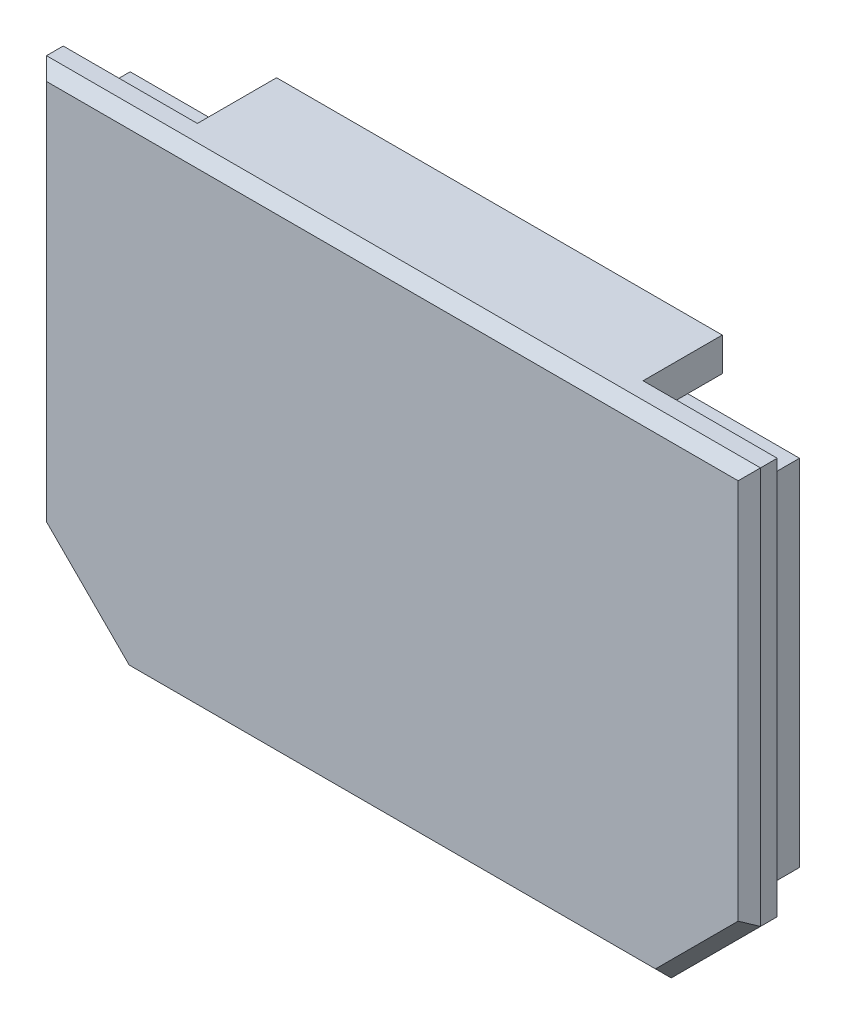
ISO-10303-21;
HEADER;
FILE_DESCRIPTION(('STEP AP214'),'2;1');
FILE_NAME('part.step','',(''),(''),'','','');
FILE_SCHEMA(('AUTOMOTIVE_DESIGN { 1 0 10303 214 1 1 1 1 }'));
ENDSEC;
DATA;
#1=APPLICATION_CONTEXT('core data for automotive mechanical design processes');
#2=APPLICATION_PROTOCOL_DEFINITION('international standard','automotive_design',2000,#1);
#3=PRODUCT_CONTEXT('',#1,'mechanical');
#4=PRODUCT('Part','Part','',(#3));
#5=PRODUCT_RELATED_PRODUCT_CATEGORY('part','',(#4));
#6=PRODUCT_DEFINITION_FORMATION('','',#4);
#7=PRODUCT_DEFINITION_CONTEXT('part definition',#1,'design');
#8=PRODUCT_DEFINITION('design','',#6,#7);
#9=PRODUCT_DEFINITION_SHAPE('','',#8);
#10=(LENGTH_UNIT() NAMED_UNIT(*) SI_UNIT(.MILLI.,.METRE.));
#11=(NAMED_UNIT(*) PLANE_ANGLE_UNIT() SI_UNIT($,.RADIAN.));
#12=(NAMED_UNIT(*) SI_UNIT($,.STERADIAN.) SOLID_ANGLE_UNIT());
#13=UNCERTAINTY_MEASURE_WITH_UNIT(LENGTH_MEASURE(1.E-05),#10,'distance_accuracy_value','');
#14=(GEOMETRIC_REPRESENTATION_CONTEXT(3) GLOBAL_UNCERTAINTY_ASSIGNED_CONTEXT((#13)) GLOBAL_UNIT_ASSIGNED_CONTEXT((#10,
#11,#12)) REPRESENTATION_CONTEXT('',''));
#15=CARTESIAN_POINT('',(0.,0.,0.));
#16=DIRECTION('',(0.,0.,1.));
#17=DIRECTION('',(1.,0.,0.));
#18=AXIS2_PLACEMENT_3D('',#15,#16,#17);
#19=CARTESIAN_POINT('',(-29.9999,-3.0001,-4.));
#20=DIRECTION('',(0.,1.,0.));
#21=DIRECTION('',(0.,0.,1.));
#22=AXIS2_PLACEMENT_3D('',#19,#20,#21);
#23=PLANE('',#22);
#24=DIRECTION('',(-1.,0.,0.));
#25=VECTOR('',#24,1.);
#26=CARTESIAN_POINT('',(-29.9999,-3.0001,-4.));
#27=LINE('',#26,#25);
#28=CARTESIAN_POINT('',(29.9999000000061,-3.0001,-4.));
#29=VERTEX_POINT('',#28);
#30=CARTESIAN_POINT('',(19.9750000000061,-3.0001,-4.));
#31=VERTEX_POINT('',#30);
#32=EDGE_CURVE('E430',#29,#31,#27,.T.);
#33=ORIENTED_EDGE('',*,*,#32,.T.);
#34=DIRECTION('',(0.,0.,1.));
#35=VECTOR('',#34,1.);
#36=CARTESIAN_POINT('',(19.9750000000061,-3.0001,-7.1));
#37=LINE('',#36,#35);
#38=CARTESIAN_POINT('',(19.9750000000061,-3.0001,0.));
#39=VERTEX_POINT('',#38);
#40=EDGE_CURVE('E272',#31,#39,#37,.T.);
#41=ORIENTED_EDGE('',*,*,#40,.T.);
#42=DIRECTION('',(-1.,0.,0.));
#43=VECTOR('',#42,1.);
#44=CARTESIAN_POINT('',(-29.9999,-3.0001,0.));
#45=LINE('',#44,#43);
#46=CARTESIAN_POINT('',(29.9999000000061,-3.0001,0.));
#47=VERTEX_POINT('',#46);
#48=EDGE_CURVE('E413',#47,#39,#45,.T.);
#49=ORIENTED_EDGE('',*,*,#48,.F.);
#50=DIRECTION('',(0.,0.,1.));
#51=VECTOR('',#50,1.);
#52=CARTESIAN_POINT('',(29.9999000000061,-3.0001,-4.));
#53=LINE('',#52,#51);
#54=EDGE_CURVE('E461',#29,#47,#53,.T.);
#55=ORIENTED_EDGE('',*,*,#54,.F.);
#56=EDGE_LOOP('',(#33,#41,#49,#55));
#57=FACE_BOUND('',#56,.T.);
#58=ADVANCED_FACE('F41',(#57),#23,.T.);
#59=CARTESIAN_POINT('',(-19.975,-3.0001,0.));
#60=VERTEX_POINT('',#59);
#61=CARTESIAN_POINT('',(-29.9999,-3.0001,0.));
#62=VERTEX_POINT('',#61);
#63=EDGE_CURVE('E452',#60,#62,#45,.T.);
#64=ORIENTED_EDGE('',*,*,#63,.F.);
#65=DIRECTION('',(0.,0.,1.));
#66=VECTOR('',#65,1.);
#67=CARTESIAN_POINT('',(-19.975,-3.0001,-7.1));
#68=LINE('',#67,#66);
#69=CARTESIAN_POINT('',(-19.975,-3.0001,-4.));
#70=VERTEX_POINT('',#69);
#71=EDGE_CURVE('E834',#70,#60,#68,.T.);
#72=ORIENTED_EDGE('',*,*,#71,.F.);
#73=CARTESIAN_POINT('',(-29.9999,-3.0001,-4.));
#74=VERTEX_POINT('',#73);
#75=EDGE_CURVE('E429',#70,#74,#27,.T.);
#76=ORIENTED_EDGE('',*,*,#75,.T.);
#77=DIRECTION('',(0.,0.,1.));
#78=VECTOR('',#77,1.);
#79=CARTESIAN_POINT('',(-29.9999,-3.0001,-4.));
#80=LINE('',#79,#78);
#81=EDGE_CURVE('E456',#74,#62,#80,.T.);
#82=ORIENTED_EDGE('',*,*,#81,.T.);
#83=EDGE_LOOP('',(#64,#72,#76,#82));
#84=FACE_BOUND('',#83,.T.);
#85=ADVANCED_FACE('F637',(#84),#23,.T.);
#86=CARTESIAN_POINT('',(0.,0.,0.));
#87=DIRECTION('',(0.,0.,-1.));
#88=DIRECTION('',(-1.,0.,0.));
#89=AXIS2_PLACEMENT_3D('',#86,#87,#88);
#90=PLANE('',#89);
#91=ORIENTED_EDGE('',*,*,#48,.T.);
#92=DIRECTION('',(0.,-1.,0.));
#93=VECTOR('',#92,1.);
#94=CARTESIAN_POINT('',(19.9750000000061,4.55020154334958E-12,0.));
#95=LINE('',#94,#93);
#96=CARTESIAN_POINT('',(19.9750000000061,4.55020154334958E-12,0.));
#97=VERTEX_POINT('',#96);
#98=EDGE_CURVE('E837',#97,#39,#95,.T.);
#99=ORIENTED_EDGE('',*,*,#98,.F.);
#100=DIRECTION('',(-1.,0.,0.));
#101=VECTOR('',#100,1.);
#102=CARTESIAN_POINT('',(-32.,0.,0.));
#103=LINE('',#102,#101);
#104=CARTESIAN_POINT('',(32.0000000000054,4.55020154334958E-12,0.));
#105=VERTEX_POINT('',#104);
#106=EDGE_CURVE('E311',#105,#97,#103,.T.);
#107=ORIENTED_EDGE('',*,*,#106,.F.);
#108=DIRECTION('',(0.,1.,0.));
#109=VECTOR('',#108,1.);
#110=CARTESIAN_POINT('',(32.0000000000054,4.55020154334958E-12,0.));
#111=LINE('',#110,#109);
#112=CARTESIAN_POINT('',(32.0000000000054,-35.6000000000053,0.));
#113=VERTEX_POINT('',#112);
#114=EDGE_CURVE('E306',#113,#105,#111,.T.);
#115=ORIENTED_EDGE('',*,*,#114,.F.);
#116=DIRECTION('',(0.707106781186548,0.707106781186547,0.));
#117=VECTOR('',#116,1.);
#118=CARTESIAN_POINT('',(32.0000000000054,-35.6000000000053,0.));
#119=LINE('',#118,#117);
#120=CARTESIAN_POINT('',(24.0000000000107,-43.6,0.));
#121=VERTEX_POINT('',#120);
#122=EDGE_CURVE('E302',#121,#113,#119,.T.);
#123=ORIENTED_EDGE('',*,*,#122,.F.);
#124=DIRECTION('',(1.,0.,0.));
#125=VECTOR('',#124,1.);
#126=CARTESIAN_POINT('',(24.0000000000107,-43.6,0.));
#127=LINE('',#126,#125);
#128=CARTESIAN_POINT('',(2.74999999999999,-43.6,0.));
#129=VERTEX_POINT('',#128);
#130=EDGE_CURVE('E299',#129,#121,#127,.T.);
#131=ORIENTED_EDGE('',*,*,#130,.F.);
#132=DIRECTION('',(0.,-1.,0.));
#133=VECTOR('',#132,1.);
#134=CARTESIAN_POINT('',(2.74999999999999,-35.4152415615735,0.));
#135=LINE('',#134,#133);
#136=CARTESIAN_POINT('',(2.74999999999999,-41.5999,0.));
#137=VERTEX_POINT('',#136);
#138=EDGE_CURVE('E551',#129,#137,#135,.F.);
#139=ORIENTED_EDGE('',*,*,#138,.T.);
#140=DIRECTION('',(1.,0.,0.));
#141=VECTOR('',#140,1.);
#142=CARTESIAN_POINT('',(23.171531453909,-41.5999,0.));
#143=LINE('',#142,#141);
#144=CARTESIAN_POINT('',(23.171531453909,-41.5999,0.));
#145=VERTEX_POINT('',#144);
#146=EDGE_CURVE('E441',#137,#145,#143,.T.);
#147=ORIENTED_EDGE('',*,*,#146,.T.);
#148=DIRECTION('',(0.707106781186547,0.707106781186548,0.));
#149=VECTOR('',#148,1.);
#150=CARTESIAN_POINT('',(29.9999000000061,-34.7715314539029,0.));
#151=LINE('',#150,#149);
#152=CARTESIAN_POINT('',(29.9999000000061,-34.7715314539029,0.));
#153=VERTEX_POINT('',#152);
#154=EDGE_CURVE('E444',#145,#153,#151,.T.);
#155=ORIENTED_EDGE('',*,*,#154,.T.);
#156=DIRECTION('',(0.,1.,0.));
#157=VECTOR('',#156,1.);
#158=CARTESIAN_POINT('',(29.9999000000061,-3.0001,0.));
#159=LINE('',#158,#157);
#160=EDGE_CURVE('E448',#153,#47,#159,.T.);
#161=ORIENTED_EDGE('',*,*,#160,.T.);
#162=EDGE_LOOP('',(#91,#99,#107,#115,#123,#131,#139,#147,#155,#161));
#163=FACE_BOUND('',#162,.T.);
#164=ADVANCED_FACE('F582',(#163),#90,.T.);
#165=CARTESIAN_POINT('',(-19.975,8.54940211855845E-13,0.));
#166=VERTEX_POINT('',#165);
#167=CARTESIAN_POINT('',(-32.,0.,0.));
#168=VERTEX_POINT('',#167);
#169=EDGE_CURVE('E310',#166,#168,#103,.T.);
#170=ORIENTED_EDGE('',*,*,#169,.F.);
#171=DIRECTION('',(0.,1.,0.));
#172=VECTOR('',#171,1.);
#173=CARTESIAN_POINT('',(-19.975,4.55020154334958E-12,0.));
#174=LINE('',#173,#172);
#175=EDGE_CURVE('E268',#60,#166,#174,.T.);
#176=ORIENTED_EDGE('',*,*,#175,.F.);
#177=ORIENTED_EDGE('',*,*,#63,.T.);
#178=DIRECTION('',(0.,-1.,0.));
#179=VECTOR('',#178,1.);
#180=CARTESIAN_POINT('',(-29.9999,-34.7715314538976,0.));
#181=LINE('',#180,#179);
#182=CARTESIAN_POINT('',(-29.9999,-34.7715314538976,0.));
#183=VERTEX_POINT('',#182);
#184=EDGE_CURVE('E388',#62,#183,#181,.T.);
#185=ORIENTED_EDGE('',*,*,#184,.T.);
#186=DIRECTION('',(0.707106781186548,-0.707106781186547,0.));
#187=VECTOR('',#186,1.);
#188=CARTESIAN_POINT('',(-23.1715314538976,-41.5999,0.));
#189=LINE('',#188,#187);
#190=CARTESIAN_POINT('',(-23.1715314538976,-41.5999,0.));
#191=VERTEX_POINT('',#190);
#192=EDGE_CURVE('E438',#183,#191,#189,.T.);
#193=ORIENTED_EDGE('',*,*,#192,.T.);
#194=CARTESIAN_POINT('',(-2.74999999999998,-41.5999,0.));
#195=VERTEX_POINT('',#194);
#196=EDGE_CURVE('E79',#191,#195,#143,.T.);
#197=ORIENTED_EDGE('',*,*,#196,.T.);
#198=DIRECTION('',(0.,1.,0.));
#199=VECTOR('',#198,1.);
#200=CARTESIAN_POINT('',(-2.74999999999998,-35.4152415615735,0.));
#201=LINE('',#200,#199);
#202=CARTESIAN_POINT('',(-2.74999999999998,-43.6,0.));
#203=VERTEX_POINT('',#202);
#204=EDGE_CURVE('E51',#195,#203,#201,.F.);
#205=ORIENTED_EDGE('',*,*,#204,.T.);
#206=CARTESIAN_POINT('',(-24.,-43.6,0.));
#207=VERTEX_POINT('',#206);
#208=EDGE_CURVE('E66',#207,#203,#127,.T.);
#209=ORIENTED_EDGE('',*,*,#208,.F.);
#210=DIRECTION('',(0.707106781186549,-0.707106781186547,0.));
#211=VECTOR('',#210,1.);
#212=CARTESIAN_POINT('',(-24.,-43.6,0.));
#213=LINE('',#212,#211);
#214=CARTESIAN_POINT('',(-32.,-35.6,0.));
#215=VERTEX_POINT('',#214);
#216=EDGE_CURVE('E294',#215,#207,#213,.T.);
#217=ORIENTED_EDGE('',*,*,#216,.F.);
#218=DIRECTION('',(0.,-1.,0.));
#219=VECTOR('',#218,1.);
#220=CARTESIAN_POINT('',(-32.,-35.6,0.));
#221=LINE('',#220,#219);
#222=EDGE_CURVE('E290',#168,#215,#221,.T.);
#223=ORIENTED_EDGE('',*,*,#222,.F.);
#224=EDGE_LOOP('',(#170,#176,#177,#185,#193,#197,#205,#209,#217,#223));
#225=FACE_BOUND('',#224,.T.);
#226=ADVANCED_FACE('F557',(#225),#90,.T.);
#227=CARTESIAN_POINT('',(-29.9999,-34.7715314538976,-4.));
#228=DIRECTION('',(-1.,0.,0.));
#229=DIRECTION('',(0.,0.,1.));
#230=AXIS2_PLACEMENT_3D('',#227,#228,#229);
#231=PLANE('',#230);
#232=ORIENTED_EDGE('',*,*,#184,.F.);
#233=ORIENTED_EDGE('',*,*,#81,.F.);
#234=DIRECTION('',(0.,-1.,0.));
#235=VECTOR('',#234,1.);
#236=CARTESIAN_POINT('',(-29.9999,-34.7715314538976,-4.));
#237=LINE('',#236,#235);
#238=CARTESIAN_POINT('',(-29.9999,-34.7715314538976,-4.));
#239=VERTEX_POINT('',#238);
#240=EDGE_CURVE('E408',#74,#239,#237,.T.);
#241=ORIENTED_EDGE('',*,*,#240,.T.);
#242=DIRECTION('',(0.,0.,1.));
#243=VECTOR('',#242,1.);
#244=CARTESIAN_POINT('',(-29.9999,-34.7715314538976,-4.));
#245=LINE('',#244,#243);
#246=EDGE_CURVE('E434',#239,#183,#245,.T.);
#247=ORIENTED_EDGE('',*,*,#246,.T.);
#248=EDGE_LOOP('',(#232,#233,#241,#247));
#249=FACE_BOUND('',#248,.T.);
#250=ADVANCED_FACE('F652',(#249),#231,.T.);
#251=CARTESIAN_POINT('',(29.9999000000061,-3.0001,-4.));
#252=DIRECTION('',(1.,0.,0.));
#253=DIRECTION('',(0.,1.,0.));
#254=AXIS2_PLACEMENT_3D('',#251,#252,#253);
#255=PLANE('',#254);
#256=ORIENTED_EDGE('',*,*,#160,.F.);
#257=DIRECTION('',(0.,0.,1.));
#258=VECTOR('',#257,1.);
#259=CARTESIAN_POINT('',(29.9999000000061,-34.7715314539029,-4.));
#260=LINE('',#259,#258);
#261=CARTESIAN_POINT('',(29.9999000000061,-34.7715314539029,-4.));
#262=VERTEX_POINT('',#261);
#263=EDGE_CURVE('E464',#262,#153,#260,.T.);
#264=ORIENTED_EDGE('',*,*,#263,.F.);
#265=DIRECTION('',(0.,1.,0.));
#266=VECTOR('',#265,1.);
#267=CARTESIAN_POINT('',(29.9999000000061,-3.0001,-4.));
#268=LINE('',#267,#266);
#269=EDGE_CURVE('E425',#262,#29,#268,.T.);
#270=ORIENTED_EDGE('',*,*,#269,.T.);
#271=ORIENTED_EDGE('',*,*,#54,.T.);
#272=EDGE_LOOP('',(#256,#264,#270,#271));
#273=FACE_BOUND('',#272,.T.);
#274=ADVANCED_FACE('F648',(#273),#255,.T.);
#275=CARTESIAN_POINT('',(29.9999000000061,-34.7715314539029,-4.));
#276=DIRECTION('',(0.707106781186548,-0.707106781186547,0.));
#277=DIRECTION('',(0.707106781186547,0.707106781186548,0.));
#278=AXIS2_PLACEMENT_3D('',#275,#276,#277);
#279=PLANE('',#278);
#280=ORIENTED_EDGE('',*,*,#154,.F.);
#281=DIRECTION('',(0.,0.,1.));
#282=VECTOR('',#281,1.);
#283=CARTESIAN_POINT('',(23.171531453909,-41.5999,-4.));
#284=LINE('',#283,#282);
#285=CARTESIAN_POINT('',(23.171531453909,-41.5999,-4.));
#286=VERTEX_POINT('',#285);
#287=EDGE_CURVE('E467',#286,#145,#284,.T.);
#288=ORIENTED_EDGE('',*,*,#287,.F.);
#289=DIRECTION('',(0.707106781186547,0.707106781186548,0.));
#290=VECTOR('',#289,1.);
#291=CARTESIAN_POINT('',(29.9999000000061,-34.7715314539029,-4.));
#292=LINE('',#291,#290);
#293=EDGE_CURVE('E421',#286,#262,#292,.T.);
#294=ORIENTED_EDGE('',*,*,#293,.T.);
#295=ORIENTED_EDGE('',*,*,#263,.T.);
#296=EDGE_LOOP('',(#280,#288,#294,#295));
#297=FACE_BOUND('',#296,.T.);
#298=ADVANCED_FACE('F651',(#297),#279,.T.);
#299=CARTESIAN_POINT('',(23.171531453909,-41.5999,-4.));
#300=DIRECTION('',(0.,-1.,0.));
#301=DIRECTION('',(1.,0.,0.));
#302=AXIS2_PLACEMENT_3D('',#299,#300,#301);
#303=PLANE('',#302);
#304=ORIENTED_EDGE('',*,*,#146,.F.);
#305=DIRECTION('',(0.707106781186551,0.,-0.707106781186544));
#306=VECTOR('',#305,1.);
#307=CARTESIAN_POINT('',(14.9607657269546,-41.5999,-12.2107657269545));
#308=LINE('',#307,#306);
#309=CARTESIAN_POINT('',(1.99999999999998,-41.5999,0.75));
#310=VERTEX_POINT('',#309);
#311=EDGE_CURVE('E544',#137,#310,#308,.F.);
#312=ORIENTED_EDGE('',*,*,#311,.T.);
#313=DIRECTION('',(1.,0.,0.));
#314=VECTOR('',#313,1.);
#315=CARTESIAN_POINT('',(-3.,-41.5999,0.75));
#316=LINE('',#315,#314);
#317=CARTESIAN_POINT('',(-1.99999999999999,-41.5999,0.75));
#318=VERTEX_POINT('',#317);
#319=EDGE_CURVE('E285',#318,#310,#316,.T.);
#320=ORIENTED_EDGE('',*,*,#319,.F.);
#321=DIRECTION('',(0.707106781186544,0.,0.707106781186551));
#322=VECTOR('',#321,1.);
#323=CARTESIAN_POINT('',(8.21076572695439,-41.5999,10.9607657269545));
#324=LINE('',#323,#322);
#325=EDGE_CURVE('E541',#318,#195,#324,.F.);
#326=ORIENTED_EDGE('',*,*,#325,.T.);
#327=ORIENTED_EDGE('',*,*,#196,.F.);
#328=DIRECTION('',(0.,0.,1.));
#329=VECTOR('',#328,1.);
#330=CARTESIAN_POINT('',(-23.1715314538976,-41.5999,-4.));
#331=LINE('',#330,#329);
#332=CARTESIAN_POINT('',(-23.1715314538976,-41.5999,-4.));
#333=VERTEX_POINT('',#332);
#334=EDGE_CURVE('E471',#333,#191,#331,.T.);
#335=ORIENTED_EDGE('',*,*,#334,.F.);
#336=DIRECTION('',(1.,0.,0.));
#337=VECTOR('',#336,1.);
#338=CARTESIAN_POINT('',(23.171531453909,-41.5999,-4.));
#339=LINE('',#338,#337);
#340=EDGE_CURVE('E417',#333,#286,#339,.T.);
#341=ORIENTED_EDGE('',*,*,#340,.T.);
#342=ORIENTED_EDGE('',*,*,#287,.T.);
#343=EDGE_LOOP('',(#304,#312,#320,#326,#327,#335,#341,#342));
#344=FACE_BOUND('',#343,.T.);
#345=ADVANCED_FACE('F566',(#344),#303,.T.);
#346=CARTESIAN_POINT('',(-23.1715314538976,-41.5999,-4.));
#347=DIRECTION('',(-0.707106781186547,-0.707106781186548,0.));
#348=DIRECTION('',(0.707106781186548,-0.707106781186547,0.));
#349=AXIS2_PLACEMENT_3D('',#346,#347,#348);
#350=PLANE('',#349);
#351=ORIENTED_EDGE('',*,*,#192,.F.);
#352=ORIENTED_EDGE('',*,*,#246,.F.);
#353=DIRECTION('',(0.707106781186548,-0.707106781186547,0.));
#354=VECTOR('',#353,1.);
#355=CARTESIAN_POINT('',(-23.1715314538976,-41.5999,-4.));
#356=LINE('',#355,#354);
#357=EDGE_CURVE('E412',#239,#333,#356,.T.);
#358=ORIENTED_EDGE('',*,*,#357,.T.);
#359=ORIENTED_EDGE('',*,*,#334,.T.);
#360=EDGE_LOOP('',(#351,#352,#358,#359));
#361=FACE_BOUND('',#360,.T.);
#362=ADVANCED_FACE('F659',(#361),#350,.T.);
#363=CARTESIAN_POINT('',(0.,0.,-4.));
#364=DIRECTION('',(0.,0.,-1.));
#365=DIRECTION('',(-1.,0.,0.));
#366=AXIS2_PLACEMENT_3D('',#363,#364,#365);
#367=PLANE('',#366);
#368=DIRECTION('',(0.707106781186548,-0.707106781186548,0.));
#369=VECTOR('',#368,1.);
#370=CARTESIAN_POINT('',(-22.3431457505076,-39.6,-4.));
#371=LINE('',#370,#369);
#372=CARTESIAN_POINT('',(-28.,-33.9431457505076,-4.));
#373=VERTEX_POINT('',#372);
#374=CARTESIAN_POINT('',(-22.3431457505076,-39.6,-4.));
#375=VERTEX_POINT('',#374);
#376=EDGE_CURVE('E336',#373,#375,#371,.T.);
#377=ORIENTED_EDGE('',*,*,#376,.T.);
#378=DIRECTION('',(1.,0.,0.));
#379=VECTOR('',#378,1.);
#380=CARTESIAN_POINT('',(22.3431457505191,-39.6,-4.));
#381=LINE('',#380,#379);
#382=CARTESIAN_POINT('',(22.3431457505191,-39.6,-4.));
#383=VERTEX_POINT('',#382);
#384=EDGE_CURVE('E340',#375,#383,#381,.T.);
#385=ORIENTED_EDGE('',*,*,#384,.T.);
#386=DIRECTION('',(0.707106781186547,0.707106781186547,0.));
#387=VECTOR('',#386,1.);
#388=CARTESIAN_POINT('',(28.0000000000061,-33.9431457505129,-4.));
#389=LINE('',#388,#387);
#390=CARTESIAN_POINT('',(28.0000000000061,-33.9431457505129,-4.));
#391=VERTEX_POINT('',#390);
#392=EDGE_CURVE('E345',#383,#391,#389,.T.);
#393=ORIENTED_EDGE('',*,*,#392,.T.);
#394=DIRECTION('',(0.,1.,0.));
#395=VECTOR('',#394,1.);
#396=CARTESIAN_POINT('',(28.0000000000061,-5.,-4.));
#397=LINE('',#396,#395);
#398=CARTESIAN_POINT('',(28.0000000000061,-5.,-4.));
#399=VERTEX_POINT('',#398);
#400=EDGE_CURVE('E349',#391,#399,#397,.T.);
#401=ORIENTED_EDGE('',*,*,#400,.T.);
#402=DIRECTION('',(-1.,0.,0.));
#403=VECTOR('',#402,1.);
#404=CARTESIAN_POINT('',(-28.,-5.,-4.));
#405=LINE('',#404,#403);
#406=CARTESIAN_POINT('',(-28.,-5.,-4.));
#407=VERTEX_POINT('',#406);
#408=EDGE_CURVE('E353',#399,#407,#405,.T.);
#409=ORIENTED_EDGE('',*,*,#408,.T.);
#410=DIRECTION('',(0.,-1.,0.));
#411=VECTOR('',#410,1.);
#412=CARTESIAN_POINT('',(-28.,-33.9431457505076,-4.));
#413=LINE('',#412,#411);
#414=EDGE_CURVE('E357',#407,#373,#413,.T.);
#415=ORIENTED_EDGE('',*,*,#414,.T.);
#416=EDGE_LOOP('',(#377,#385,#393,#401,#409,#415));
#417=FACE_BOUND('',#416,.T.);
#418=ORIENTED_EDGE('',*,*,#240,.F.);
#419=ORIENTED_EDGE('',*,*,#75,.F.);
#420=DIRECTION('',(1.,0.,0.));
#421=VECTOR('',#420,1.);
#422=CARTESIAN_POINT('',(0.,-3.0001,-4.));
#423=LINE('',#422,#421);
#424=EDGE_CURVE('E274',#70,#31,#423,.T.);
#425=ORIENTED_EDGE('',*,*,#424,.T.);
#426=ORIENTED_EDGE('',*,*,#32,.F.);
#427=ORIENTED_EDGE('',*,*,#269,.F.);
#428=ORIENTED_EDGE('',*,*,#293,.F.);
#429=ORIENTED_EDGE('',*,*,#340,.F.);
#430=ORIENTED_EDGE('',*,*,#357,.F.);
#431=EDGE_LOOP('',(#418,#419,#425,#426,#427,#428,#429,#430));
#432=FACE_BOUND('',#431,.T.);
#433=ADVANCED_FACE('F646',(#417,#432),#367,.T.);
#434=CARTESIAN_POINT('',(-22.3431457505076,-39.6,-4.));
#435=DIRECTION('',(-0.707106781186547,-0.707106781186547,0.));
#436=DIRECTION('',(0.707106781186548,-0.707106781186548,0.));
#437=AXIS2_PLACEMENT_3D('',#434,#435,#436);
#438=PLANE('',#437);
#439=DIRECTION('',(0.707106781186548,-0.707106781186548,0.));
#440=VECTOR('',#439,1.);
#441=CARTESIAN_POINT('',(-22.3431457505076,-39.6,0.));
#442=LINE('',#441,#440);
#443=CARTESIAN_POINT('',(-28.,-33.9431457505076,0.));
#444=VERTEX_POINT('',#443);
#445=CARTESIAN_POINT('',(-22.3431457505076,-39.6,0.));
#446=VERTEX_POINT('',#445);
#447=EDGE_CURVE('E335',#444,#446,#442,.T.);
#448=ORIENTED_EDGE('',*,*,#447,.T.);
#449=DIRECTION('',(0.,0.,1.));
#450=VECTOR('',#449,1.);
#451=CARTESIAN_POINT('',(-22.3431457505076,-39.6,-4.));
#452=LINE('',#451,#450);
#453=EDGE_CURVE('E361',#375,#446,#452,.T.);
#454=ORIENTED_EDGE('',*,*,#453,.F.);
#455=ORIENTED_EDGE('',*,*,#376,.F.);
#456=DIRECTION('',(0.,0.,1.));
#457=VECTOR('',#456,1.);
#458=CARTESIAN_POINT('',(-28.,-33.9431457505076,-4.));
#459=LINE('',#458,#457);
#460=EDGE_CURVE('E384',#373,#444,#459,.T.);
#461=ORIENTED_EDGE('',*,*,#460,.T.);
#462=EDGE_LOOP('',(#448,#454,#455,#461));
#463=FACE_BOUND('',#462,.T.);
#464=ADVANCED_FACE('F724',(#463),#438,.F.);
#465=CARTESIAN_POINT('',(-28.,-33.9431457505076,-4.));
#466=DIRECTION('',(-1.,0.,0.));
#467=DIRECTION('',(0.,0.,1.));
#468=AXIS2_PLACEMENT_3D('',#465,#466,#467);
#469=PLANE('',#468);
#470=DIRECTION('',(0.,-1.,0.));
#471=VECTOR('',#470,1.);
#472=CARTESIAN_POINT('',(-28.,-33.9431457505076,0.));
#473=LINE('',#472,#471);
#474=CARTESIAN_POINT('',(-28.,-5.,0.));
#475=VERTEX_POINT('',#474);
#476=EDGE_CURVE('E341',#475,#444,#473,.T.);
#477=ORIENTED_EDGE('',*,*,#476,.T.);
#478=ORIENTED_EDGE('',*,*,#460,.F.);
#479=ORIENTED_EDGE('',*,*,#414,.F.);
#480=DIRECTION('',(0.,0.,1.));
#481=VECTOR('',#480,1.);
#482=CARTESIAN_POINT('',(-28.,-5.,-4.));
#483=LINE('',#482,#481);
#484=EDGE_CURVE('E389',#407,#475,#483,.T.);
#485=ORIENTED_EDGE('',*,*,#484,.T.);
#486=EDGE_LOOP('',(#477,#478,#479,#485));
#487=FACE_BOUND('',#486,.T.);
#488=ADVANCED_FACE('F720',(#487),#469,.F.);
#489=CARTESIAN_POINT('',(-28.,-5.,-4.));
#490=DIRECTION('',(0.,1.,0.));
#491=DIRECTION('',(0.,0.,1.));
#492=AXIS2_PLACEMENT_3D('',#489,#490,#491);
#493=PLANE('',#492);
#494=DIRECTION('',(-1.,0.,0.));
#495=VECTOR('',#494,1.);
#496=CARTESIAN_POINT('',(-28.,-5.,0.));
#497=LINE('',#496,#495);
#498=CARTESIAN_POINT('',(28.0000000000061,-5.,0.));
#499=VERTEX_POINT('',#498);
#500=EDGE_CURVE('E377',#499,#475,#497,.T.);
#501=ORIENTED_EDGE('',*,*,#500,.T.);
#502=ORIENTED_EDGE('',*,*,#484,.F.);
#503=ORIENTED_EDGE('',*,*,#408,.F.);
#504=DIRECTION('',(0.,0.,1.));
#505=VECTOR('',#504,1.);
#506=CARTESIAN_POINT('',(28.0000000000061,-5.,-4.));
#507=LINE('',#506,#505);
#508=EDGE_CURVE('E393',#399,#499,#507,.T.);
#509=ORIENTED_EDGE('',*,*,#508,.T.);
#510=EDGE_LOOP('',(#501,#502,#503,#509));
#511=FACE_BOUND('',#510,.T.);
#512=ADVANCED_FACE('F723',(#511),#493,.F.);
#513=CARTESIAN_POINT('',(28.0000000000061,-5.,-4.));
#514=DIRECTION('',(1.,0.,0.));
#515=DIRECTION('',(0.,0.,-1.));
#516=AXIS2_PLACEMENT_3D('',#513,#514,#515);
#517=PLANE('',#516);
#518=DIRECTION('',(0.,1.,0.));
#519=VECTOR('',#518,1.);
#520=CARTESIAN_POINT('',(28.0000000000061,-5.,0.));
#521=LINE('',#520,#519);
#522=CARTESIAN_POINT('',(28.0000000000061,-33.9431457505129,0.));
#523=VERTEX_POINT('',#522);
#524=EDGE_CURVE('E373',#523,#499,#521,.T.);
#525=ORIENTED_EDGE('',*,*,#524,.T.);
#526=ORIENTED_EDGE('',*,*,#508,.F.);
#527=ORIENTED_EDGE('',*,*,#400,.F.);
#528=DIRECTION('',(0.,0.,1.));
#529=VECTOR('',#528,1.);
#530=CARTESIAN_POINT('',(28.0000000000061,-33.9431457505129,-4.));
#531=LINE('',#530,#529);
#532=EDGE_CURVE('E397',#391,#523,#531,.T.);
#533=ORIENTED_EDGE('',*,*,#532,.T.);
#534=EDGE_LOOP('',(#525,#526,#527,#533));
#535=FACE_BOUND('',#534,.T.);
#536=ADVANCED_FACE('F728',(#535),#517,.F.);
#537=CARTESIAN_POINT('',(28.0000000000061,-33.9431457505129,-4.));
#538=DIRECTION('',(0.707106781186547,-0.707106781186547,0.));
#539=DIRECTION('',(0.707106781186548,0.707106781186548,0.));
#540=AXIS2_PLACEMENT_3D('',#537,#538,#539);
#541=PLANE('',#540);
#542=DIRECTION('',(0.707106781186547,0.707106781186547,0.));
#543=VECTOR('',#542,1.);
#544=CARTESIAN_POINT('',(28.0000000000061,-33.9431457505129,0.));
#545=LINE('',#544,#543);
#546=CARTESIAN_POINT('',(22.3431457505191,-39.6,0.));
#547=VERTEX_POINT('',#546);
#548=EDGE_CURVE('E369',#547,#523,#545,.T.);
#549=ORIENTED_EDGE('',*,*,#548,.T.);
#550=ORIENTED_EDGE('',*,*,#532,.F.);
#551=ORIENTED_EDGE('',*,*,#392,.F.);
#552=DIRECTION('',(0.,0.,1.));
#553=VECTOR('',#552,1.);
#554=CARTESIAN_POINT('',(22.3431457505191,-39.6,-4.));
#555=LINE('',#554,#553);
#556=EDGE_CURVE('E401',#383,#547,#555,.T.);
#557=ORIENTED_EDGE('',*,*,#556,.T.);
#558=EDGE_LOOP('',(#549,#550,#551,#557));
#559=FACE_BOUND('',#558,.T.);
#560=ADVANCED_FACE('F732',(#559),#541,.F.);
#561=CARTESIAN_POINT('',(22.3431457505191,-39.6,-4.));
#562=DIRECTION('',(0.,-1.,0.));
#563=DIRECTION('',(0.,0.,-1.));
#564=AXIS2_PLACEMENT_3D('',#561,#562,#563);
#565=PLANE('',#564);
#566=DIRECTION('',(1.,0.,0.));
#567=VECTOR('',#566,1.);
#568=CARTESIAN_POINT('',(22.3431457505191,-39.6,0.));
#569=LINE('',#568,#567);
#570=EDGE_CURVE('E365',#446,#547,#569,.T.);
#571=ORIENTED_EDGE('',*,*,#570,.T.);
#572=ORIENTED_EDGE('',*,*,#556,.F.);
#573=ORIENTED_EDGE('',*,*,#384,.F.);
#574=ORIENTED_EDGE('',*,*,#453,.T.);
#575=EDGE_LOOP('',(#571,#572,#573,#574));
#576=FACE_BOUND('',#575,.T.);
#577=ADVANCED_FACE('F705',(#576),#565,.F.);
#578=CARTESIAN_POINT('',(0.,0.,2.5));
#579=DIRECTION('',(0.,0.,-1.));
#580=DIRECTION('',(-1.,0.,0.));
#581=AXIS2_PLACEMENT_3D('',#578,#579,#580);
#582=PLANE('',#581);
#583=DIRECTION('',(0.,1.,0.));
#584=VECTOR('',#583,1.);
#585=CARTESIAN_POINT('',(31.0000000000054,0.,2.5));
#586=LINE('',#585,#584);
#587=CARTESIAN_POINT('',(31.0000000000054,-35.1857864376322,2.5));
#588=VERTEX_POINT('',#587);
#589=CARTESIAN_POINT('',(31.0000000000054,-0.999999999995522,2.5));
#590=VERTEX_POINT('',#589);
#591=EDGE_CURVE('E487',#588,#590,#586,.T.);
#592=ORIENTED_EDGE('',*,*,#591,.T.);
#593=DIRECTION('',(-1.,0.,0.));
#594=VECTOR('',#593,1.);
#595=CARTESIAN_POINT('',(0.,-0.999999999997726,2.5));
#596=LINE('',#595,#594);
#597=CARTESIAN_POINT('',(-31.,-0.99999999999993,2.5));
#598=VERTEX_POINT('',#597);
#599=EDGE_CURVE('E490',#590,#598,#596,.T.);
#600=ORIENTED_EDGE('',*,*,#599,.T.);
#601=DIRECTION('',(0.,-1.,0.));
#602=VECTOR('',#601,1.);
#603=CARTESIAN_POINT('',(-31.,0.,2.5));
#604=LINE('',#603,#602);
#605=CARTESIAN_POINT('',(-31.,-35.1857864376269,2.5));
#606=VERTEX_POINT('',#605);
#607=EDGE_CURVE('E460',#598,#606,#604,.T.);
#608=ORIENTED_EDGE('',*,*,#607,.T.);
#609=DIRECTION('',(0.707106781186548,-0.707106781186547,0.));
#610=VECTOR('',#609,1.);
#611=CARTESIAN_POINT('',(-33.0928932188134,-33.0928932188135,2.5));
#612=LINE('',#611,#610);
#613=CARTESIAN_POINT('',(-23.5857864376269,-42.6,2.5));
#614=VERTEX_POINT('',#613);
#615=EDGE_CURVE('E478',#606,#614,#612,.T.);
#616=ORIENTED_EDGE('',*,*,#615,.T.);
#617=DIRECTION('',(1.,0.,0.));
#618=VECTOR('',#617,1.);
#619=CARTESIAN_POINT('',(0.,-42.6,2.5));
#620=LINE('',#619,#618);
#621=CARTESIAN_POINT('',(23.5857864376376,-42.6,2.5));
#622=VERTEX_POINT('',#621);
#623=EDGE_CURVE('E481',#614,#622,#620,.T.);
#624=ORIENTED_EDGE('',*,*,#623,.T.);
#625=DIRECTION('',(0.707106781186548,0.707106781186547,0.));
#626=VECTOR('',#625,1.);
#627=CARTESIAN_POINT('',(33.0928932188188,-33.0928932188188,2.5));
#628=LINE('',#627,#626);
#629=EDGE_CURVE('E484',#622,#588,#628,.T.);
#630=ORIENTED_EDGE('',*,*,#629,.T.);
#631=EDGE_LOOP('',(#592,#600,#608,#616,#624,#630));
#632=FACE_BOUND('',#631,.T.);
#633=ADVANCED_FACE('F600',(#632),#582,.F.);
#634=CARTESIAN_POINT('',(-32.,0.,2.5));
#635=DIRECTION('',(0.,-1.,0.));
#636=DIRECTION('',(1.,0.,0.));
#637=AXIS2_PLACEMENT_3D('',#634,#635,#636);
#638=PLANE('',#637);
#639=DIRECTION('',(0.,0.,-1.));
#640=VECTOR('',#639,1.);
#641=CARTESIAN_POINT('',(-32.,0.,2.5));
#642=LINE('',#641,#640);
#643=CARTESIAN_POINT('',(-32.,0.,1.49999999999999));
#644=VERTEX_POINT('',#643);
#645=EDGE_CURVE('E315',#644,#168,#642,.T.);
#646=ORIENTED_EDGE('',*,*,#645,.F.);
#647=DIRECTION('',(1.,0.,0.));
#648=VECTOR('',#647,1.);
#649=CARTESIAN_POINT('',(-32.,0.,1.49999999999999));
#650=LINE('',#649,#648);
#651=CARTESIAN_POINT('',(32.0000000000054,4.55020154334958E-12,1.49999999999999));
#652=VERTEX_POINT('',#651);
#653=EDGE_CURVE('E494',#644,#652,#650,.T.);
#654=ORIENTED_EDGE('',*,*,#653,.T.);
#655=DIRECTION('',(0.,0.,-1.));
#656=VECTOR('',#655,1.);
#657=CARTESIAN_POINT('',(32.0000000000054,4.55020154334958E-12,2.5));
#658=LINE('',#657,#656);
#659=EDGE_CURVE('E319',#652,#105,#658,.T.);
#660=ORIENTED_EDGE('',*,*,#659,.T.);
#661=ORIENTED_EDGE('',*,*,#106,.T.);
#662=DIRECTION('',(0.,0.,1.));
#663=VECTOR('',#662,1.);
#664=CARTESIAN_POINT('',(19.9750000000061,4.55020154334958E-12,-7.1));
#665=LINE('',#664,#663);
#666=CARTESIAN_POINT('',(19.9750000000061,4.55020154334958E-12,-7.1));
#667=VERTEX_POINT('',#666);
#668=EDGE_CURVE('E859',#667,#97,#665,.T.);
#669=ORIENTED_EDGE('',*,*,#668,.F.);
#670=DIRECTION('',(1.,0.,0.));
#671=VECTOR('',#670,1.);
#672=CARTESIAN_POINT('',(19.9750000000061,4.55020154334958E-12,-7.1));
#673=LINE('',#672,#671);
#674=CARTESIAN_POINT('',(-19.975,4.55020154334958E-12,-7.1));
#675=VERTEX_POINT('',#674);
#676=EDGE_CURVE('E264',#675,#667,#673,.T.);
#677=ORIENTED_EDGE('',*,*,#676,.F.);
#678=DIRECTION('',(0.,0.,1.));
#679=VECTOR('',#678,1.);
#680=CARTESIAN_POINT('',(-19.975,4.55020154334958E-12,-7.1));
#681=LINE('',#680,#679);
#682=EDGE_CURVE('E58',#675,#166,#681,.T.);
#683=ORIENTED_EDGE('',*,*,#682,.T.);
#684=ORIENTED_EDGE('',*,*,#169,.T.);
#685=EDGE_LOOP('',(#646,#654,#660,#661,#669,#677,#683,#684));
#686=FACE_BOUND('',#685,.T.);
#687=ADVANCED_FACE('F618',(#686),#638,.F.);
#688=CARTESIAN_POINT('',(32.0000000000054,4.55020154334958E-12,2.5));
#689=DIRECTION('',(-1.,0.,0.));
#690=DIRECTION('',(0.,0.,1.));
#691=AXIS2_PLACEMENT_3D('',#688,#689,#690);
#692=PLANE('',#691);
#693=ORIENTED_EDGE('',*,*,#659,.F.);
#694=DIRECTION('',(0.,-1.,0.));
#695=VECTOR('',#694,1.);
#696=CARTESIAN_POINT('',(32.0000000000054,4.55020154334958E-12,1.49999999999999));
#697=LINE('',#696,#695);
#698=CARTESIAN_POINT('',(32.0000000000054,-35.6000000000053,1.49999999999999));
#699=VERTEX_POINT('',#698);
#700=EDGE_CURVE('E498',#652,#699,#697,.T.);
#701=ORIENTED_EDGE('',*,*,#700,.T.);
#702=DIRECTION('',(0.,0.,-1.));
#703=VECTOR('',#702,1.);
#704=CARTESIAN_POINT('',(32.0000000000054,-35.6000000000053,2.5));
#705=LINE('',#704,#703);
#706=EDGE_CURVE('E322',#699,#113,#705,.T.);
#707=ORIENTED_EDGE('',*,*,#706,.T.);
#708=ORIENTED_EDGE('',*,*,#114,.T.);
#709=EDGE_LOOP('',(#693,#701,#707,#708));
#710=FACE_BOUND('',#709,.T.);
#711=ADVANCED_FACE('F587',(#710),#692,.F.);
#712=CARTESIAN_POINT('',(32.0000000000054,-35.6000000000053,2.5));
#713=DIRECTION('',(-0.707106781186547,0.707106781186548,0.));
#714=DIRECTION('',(-0.707106781186548,-0.707106781186547,0.));
#715=AXIS2_PLACEMENT_3D('',#712,#713,#714);
#716=PLANE('',#715);
#717=ORIENTED_EDGE('',*,*,#706,.F.);
#718=DIRECTION('',(-0.707106781186548,-0.707106781186547,0.));
#719=VECTOR('',#718,1.);
#720=CARTESIAN_POINT('',(32.0000000000054,-35.6000000000053,1.49999999999999));
#721=LINE('',#720,#719);
#722=CARTESIAN_POINT('',(24.0000000000107,-43.6,1.49999999999999));
#723=VERTEX_POINT('',#722);
#724=EDGE_CURVE('E501',#699,#723,#721,.T.);
#725=ORIENTED_EDGE('',*,*,#724,.T.);
#726=DIRECTION('',(0.,0.,-1.));
#727=VECTOR('',#726,1.);
#728=CARTESIAN_POINT('',(24.0000000000107,-43.6,2.5));
#729=LINE('',#728,#727);
#730=EDGE_CURVE('E325',#723,#121,#729,.T.);
#731=ORIENTED_EDGE('',*,*,#730,.T.);
#732=ORIENTED_EDGE('',*,*,#122,.T.);
#733=EDGE_LOOP('',(#717,#725,#731,#732));
#734=FACE_BOUND('',#733,.T.);
#735=ADVANCED_FACE('F579',(#734),#716,.F.);
#736=CARTESIAN_POINT('',(24.0000000000107,-43.6,2.5));
#737=DIRECTION('',(0.,1.,0.));
#738=DIRECTION('',(0.,0.,1.));
#739=AXIS2_PLACEMENT_3D('',#736,#737,#738);
#740=PLANE('',#739);
#741=DIRECTION('',(-1.,0.,0.));
#742=VECTOR('',#741,1.);
#743=CARTESIAN_POINT('',(-3.,-43.6,0.75));
#744=LINE('',#743,#742);
#745=CARTESIAN_POINT('',(1.99999999999998,-43.6,0.75));
#746=VERTEX_POINT('',#745);
#747=CARTESIAN_POINT('',(-1.99999999999999,-43.6,0.75));
#748=VERTEX_POINT('',#747);
#749=EDGE_CURVE('E278',#746,#748,#744,.T.);
#750=ORIENTED_EDGE('',*,*,#749,.F.);
#751=DIRECTION('',(-0.707106781186551,0.,0.707106781186544));
#752=VECTOR('',#751,1.);
#753=CARTESIAN_POINT('',(12.1250000000055,-43.6,-9.37500000000536));
#754=LINE('',#753,#752);
#755=EDGE_CURVE('E547',#746,#129,#754,.F.);
#756=ORIENTED_EDGE('',*,*,#755,.T.);
#757=ORIENTED_EDGE('',*,*,#130,.T.);
#758=ORIENTED_EDGE('',*,*,#730,.F.);
#759=DIRECTION('',(-1.,0.,0.));
#760=VECTOR('',#759,1.);
#761=CARTESIAN_POINT('',(24.0000000000107,-43.6,1.49999999999999));
#762=LINE('',#761,#760);
#763=CARTESIAN_POINT('',(-24.,-43.6,1.49999999999999));
#764=VERTEX_POINT('',#763);
#765=EDGE_CURVE('E504',#723,#764,#762,.T.);
#766=ORIENTED_EDGE('',*,*,#765,.T.);
#767=DIRECTION('',(0.,0.,-1.));
#768=VECTOR('',#767,1.);
#769=CARTESIAN_POINT('',(-24.,-43.6,2.5));
#770=LINE('',#769,#768);
#771=EDGE_CURVE('E329',#764,#207,#770,.T.);
#772=ORIENTED_EDGE('',*,*,#771,.T.);
#773=ORIENTED_EDGE('',*,*,#208,.T.);
#774=DIRECTION('',(-0.707106781186544,0.,-0.707106781186551));
#775=VECTOR('',#774,1.);
#776=CARTESIAN_POINT('',(11.8750000000052,-43.6,14.6250000000053));
#777=LINE('',#776,#775);
#778=EDGE_CURVE('E11',#203,#748,#777,.F.);
#779=ORIENTED_EDGE('',*,*,#778,.T.);
#780=EDGE_LOOP('',(#750,#756,#757,#758,#766,#772,#773,#779));
#781=FACE_BOUND('',#780,.T.);
#782=ADVANCED_FACE('F571',(#781),#740,.F.);
#783=CARTESIAN_POINT('',(-24.,-43.6,2.5));
#784=DIRECTION('',(0.707106781186547,0.707106781186548,0.));
#785=DIRECTION('',(-0.707106781186548,0.707106781186547,0.));
#786=AXIS2_PLACEMENT_3D('',#783,#784,#785);
#787=PLANE('',#786);
#788=ORIENTED_EDGE('',*,*,#771,.F.);
#789=DIRECTION('',(-0.707106781186548,0.707106781186547,0.));
#790=VECTOR('',#789,1.);
#791=CARTESIAN_POINT('',(-24.,-43.6,1.49999999999999));
#792=LINE('',#791,#790);
#793=CARTESIAN_POINT('',(-32.,-35.6,1.49999999999999));
#794=VERTEX_POINT('',#793);
#795=EDGE_CURVE('E507',#764,#794,#792,.T.);
#796=ORIENTED_EDGE('',*,*,#795,.T.);
#797=DIRECTION('',(0.,0.,-1.));
#798=VECTOR('',#797,1.);
#799=CARTESIAN_POINT('',(-32.,-35.6,2.5));
#800=LINE('',#799,#798);
#801=EDGE_CURVE('E332',#794,#215,#800,.T.);
#802=ORIENTED_EDGE('',*,*,#801,.T.);
#803=ORIENTED_EDGE('',*,*,#216,.T.);
#804=EDGE_LOOP('',(#788,#796,#802,#803));
#805=FACE_BOUND('',#804,.T.);
#806=ADVANCED_FACE('F609',(#805),#787,.F.);
#807=CARTESIAN_POINT('',(-32.,-35.6,2.5));
#808=DIRECTION('',(1.,0.,0.));
#809=DIRECTION('',(0.,0.,-1.));
#810=AXIS2_PLACEMENT_3D('',#807,#808,#809);
#811=PLANE('',#810);
#812=ORIENTED_EDGE('',*,*,#801,.F.);
#813=DIRECTION('',(0.,1.,0.));
#814=VECTOR('',#813,1.);
#815=CARTESIAN_POINT('',(-32.,-35.6,1.49999999999999));
#816=LINE('',#815,#814);
#817=EDGE_CURVE('E510',#794,#644,#816,.T.);
#818=ORIENTED_EDGE('',*,*,#817,.T.);
#819=ORIENTED_EDGE('',*,*,#645,.T.);
#820=ORIENTED_EDGE('',*,*,#222,.T.);
#821=EDGE_LOOP('',(#812,#818,#819,#820));
#822=FACE_BOUND('',#821,.T.);
#823=ADVANCED_FACE('F613',(#822),#811,.F.);
#824=ORIENTED_EDGE('',*,*,#570,.F.);
#825=ORIENTED_EDGE('',*,*,#447,.F.);
#826=ORIENTED_EDGE('',*,*,#476,.F.);
#827=ORIENTED_EDGE('',*,*,#500,.F.);
#828=ORIENTED_EDGE('',*,*,#524,.F.);
#829=ORIENTED_EDGE('',*,*,#548,.F.);
#830=EDGE_LOOP('',(#824,#825,#826,#827,#828,#829));
#831=FACE_BOUND('',#830,.T.);
#832=ADVANCED_FACE('F689',(#831),#90,.T.);
#833=CARTESIAN_POINT('',(0.,-42.6,2.5));
#834=DIRECTION('',(0.,0.70710678118655,-0.707106781186545));
#835=DIRECTION('',(1.,0.,0.));
#836=AXIS2_PLACEMENT_3D('',#833,#834,#835);
#837=PLANE('',#836);
#838=DIRECTION('',(0.281084637714823,0.678598344545844,0.678598344545849));
#839=VECTOR('',#838,1.);
#840=CARTESIAN_POINT('',(-22.5235098968804,-40.0354375683391,5.0645624316609));
#841=LINE('',#840,#839);
#842=EDGE_CURVE('E527',#764,#614,#841,.T.);
#843=ORIENTED_EDGE('',*,*,#842,.F.);
#844=ORIENTED_EDGE('',*,*,#765,.F.);
#845=DIRECTION('',(-0.281084637714812,0.678598344545846,0.678598344545851));
#846=VECTOR('',#845,1.);
#847=CARTESIAN_POINT('',(21.7223070949263,-38.1011628976243,6.99883710237577));
#848=LINE('',#847,#846);
#849=EDGE_CURVE('E295',#622,#723,#848,.F.);
#850=ORIENTED_EDGE('',*,*,#849,.F.);
#851=ORIENTED_EDGE('',*,*,#623,.F.);
#852=EDGE_LOOP('',(#843,#844,#850,#851));
#853=FACE_BOUND('',#852,.T.);
#854=ADVANCED_FACE('F605',(#853),#837,.F.);
#855=CARTESIAN_POINT('',(33.0928932188188,-33.0928932188188,2.5));
#856=DIRECTION('',(-0.500000000000004,0.500000000000004,-0.707106781186542));
#857=DIRECTION('',(0.707106781186548,0.707106781186547,0.));
#858=AXIS2_PLACEMENT_3D('',#855,#856,#857);
#859=PLANE('',#858);
#860=ORIENTED_EDGE('',*,*,#849,.T.);
#861=ORIENTED_EDGE('',*,*,#724,.F.);
#862=DIRECTION('',(-0.678598344545846,0.281084637714812,0.678598344545851));
#863=VECTOR('',#862,1.);
#864=CARTESIAN_POINT('',(31.5645624316663,-35.4196358536325,1.93543756833905));
#865=LINE('',#864,#863);
#866=EDGE_CURVE('E523',#588,#699,#865,.F.);
#867=ORIENTED_EDGE('',*,*,#866,.F.);
#868=ORIENTED_EDGE('',*,*,#629,.F.);
#869=EDGE_LOOP('',(#860,#861,#867,#868));
#870=FACE_BOUND('',#869,.T.);
#871=ADVANCED_FACE('F591',(#870),#859,.F.);
#872=CARTESIAN_POINT('',(-33.0928932188134,-33.0928932188135,2.5));
#873=DIRECTION('',(0.5,0.500000000000001,-0.707106781186547));
#874=DIRECTION('',(0.707106781186548,-0.707106781186547,0.));
#875=AXIS2_PLACEMENT_3D('',#872,#873,#874);
#876=PLANE('',#875);
#877=ORIENTED_EDGE('',*,*,#842,.T.);
#878=ORIENTED_EDGE('',*,*,#615,.F.);
#879=DIRECTION('',(0.678598344545844,0.281084637714824,0.678598344545849));
#880=VECTOR('',#879,1.);
#881=CARTESIAN_POINT('',(-24.2885374875918,-32.4058076416288,9.21146251240827));
#882=LINE('',#881,#880);
#883=EDGE_CURVE('E519',#794,#606,#882,.T.);
#884=ORIENTED_EDGE('',*,*,#883,.F.);
#885=ORIENTED_EDGE('',*,*,#795,.F.);
#886=EDGE_LOOP('',(#877,#878,#884,#885));
#887=FACE_BOUND('',#886,.T.);
#888=ADVANCED_FACE('F626',(#887),#876,.F.);
#889=CARTESIAN_POINT('',(31.0000000000054,0.,2.5));
#890=DIRECTION('',(-0.70710678118655,0.,-0.707106781186545));
#891=DIRECTION('',(0.,1.,0.));
#892=AXIS2_PLACEMENT_3D('',#889,#890,#891);
#893=PLANE('',#892);
#894=ORIENTED_EDGE('',*,*,#866,.T.);
#895=ORIENTED_EDGE('',*,*,#700,.F.);
#896=DIRECTION('',(-0.577350269189611,-0.577350269189652,0.577350269189615));
#897=VECTOR('',#896,1.);
#898=CARTESIAN_POINT('',(31.3333333333372,-0.666666666663651,2.16666666666815));
#899=LINE('',#898,#897);
#900=EDGE_CURVE('E516',#590,#652,#899,.F.);
#901=ORIENTED_EDGE('',*,*,#900,.F.);
#902=ORIENTED_EDGE('',*,*,#591,.F.);
#903=EDGE_LOOP('',(#894,#895,#901,#902));
#904=FACE_BOUND('',#903,.T.);
#905=ADVANCED_FACE('F596',(#904),#893,.F.);
#906=CARTESIAN_POINT('',(-31.,0.,2.5));
#907=DIRECTION('',(0.70710678118655,0.,-0.707106781186545));
#908=DIRECTION('',(0.,-1.,0.));
#909=AXIS2_PLACEMENT_3D('',#906,#907,#908);
#910=PLANE('',#909);
#911=ORIENTED_EDGE('',*,*,#883,.T.);
#912=ORIENTED_EDGE('',*,*,#607,.F.);
#913=DIRECTION('',(-0.577350269189638,0.577350269189597,-0.577350269189642));
#914=VECTOR('',#913,1.);
#915=CARTESIAN_POINT('',(-31.3333333333333,-0.666666666666653,2.1666666666667));
#916=LINE('',#915,#914);
#917=EDGE_CURVE('E289',#644,#598,#916,.F.);
#918=ORIENTED_EDGE('',*,*,#917,.F.);
#919=ORIENTED_EDGE('',*,*,#817,.F.);
#920=EDGE_LOOP('',(#911,#912,#918,#919));
#921=FACE_BOUND('',#920,.T.);
#922=ADVANCED_FACE('F624',(#921),#910,.F.);
#923=CARTESIAN_POINT('',(0.,-0.999999999997726,2.5));
#924=DIRECTION('',(0.,-0.70710678118655,-0.707106781186545));
#925=DIRECTION('',(-1.,0.,0.));
#926=AXIS2_PLACEMENT_3D('',#923,#924,#925);
#927=PLANE('',#926);
#928=ORIENTED_EDGE('',*,*,#900,.T.);
#929=ORIENTED_EDGE('',*,*,#653,.F.);
#930=ORIENTED_EDGE('',*,*,#917,.T.);
#931=ORIENTED_EDGE('',*,*,#599,.F.);
#932=EDGE_LOOP('',(#928,#929,#930,#931));
#933=FACE_BOUND('',#932,.T.);
#934=ADVANCED_FACE('F621',(#933),#927,.F.);
#935=CARTESIAN_POINT('',(-3.,-35.4152415615735,0.75));
#936=DIRECTION('',(0.,0.,1.));
#937=DIRECTION('',(1.,0.,0.));
#938=AXIS2_PLACEMENT_3D('',#935,#936,#937);
#939=PLANE('',#938);
#940=ORIENTED_EDGE('',*,*,#319,.T.);
#941=DIRECTION('',(0.,-1.,0.));
#942=VECTOR('',#941,1.);
#943=CARTESIAN_POINT('',(1.99999999999998,-43.6,0.75));
#944=LINE('',#943,#942);
#945=EDGE_CURVE('E537',#310,#746,#944,.T.);
#946=ORIENTED_EDGE('',*,*,#945,.T.);
#947=ORIENTED_EDGE('',*,*,#749,.T.);
#948=DIRECTION('',(0.,1.,0.));
#949=VECTOR('',#948,1.);
#950=CARTESIAN_POINT('',(-1.99999999999999,-41.5999,0.75));
#951=LINE('',#950,#949);
#952=EDGE_CURVE('E513',#748,#318,#951,.T.);
#953=ORIENTED_EDGE('',*,*,#952,.T.);
#954=EDGE_LOOP('',(#940,#946,#947,#953));
#955=FACE_BOUND('',#954,.T.);
#956=ADVANCED_FACE('F563',(#955),#939,.F.);
#957=CARTESIAN_POINT('',(1.99999999999998,-35.4152415615735,0.75));
#958=DIRECTION('',(-0.707106781186544,0.,-0.707106781186551));
#959=DIRECTION('',(0.,1.,0.));
#960=AXIS2_PLACEMENT_3D('',#957,#958,#959);
#961=PLANE('',#960);
#962=ORIENTED_EDGE('',*,*,#311,.F.);
#963=ORIENTED_EDGE('',*,*,#138,.F.);
#964=ORIENTED_EDGE('',*,*,#755,.F.);
#965=ORIENTED_EDGE('',*,*,#945,.F.);
#966=EDGE_LOOP('',(#962,#963,#964,#965));
#967=FACE_BOUND('',#966,.T.);
#968=ADVANCED_FACE('F570',(#967),#961,.T.);
#969=CARTESIAN_POINT('',(-3.,-35.4152415615735,-0.250000000000018));
#970=DIRECTION('',(0.707106781186551,0.,-0.707106781186544));
#971=DIRECTION('',(0.,1.,0.));
#972=AXIS2_PLACEMENT_3D('',#969,#970,#971);
#973=PLANE('',#972);
#974=ORIENTED_EDGE('',*,*,#325,.F.);
#975=ORIENTED_EDGE('',*,*,#952,.F.);
#976=ORIENTED_EDGE('',*,*,#778,.F.);
#977=ORIENTED_EDGE('',*,*,#204,.F.);
#978=EDGE_LOOP('',(#974,#975,#976,#977));
#979=FACE_BOUND('',#978,.T.);
#980=ADVANCED_FACE('F44',(#979),#973,.T.);
#981=CARTESIAN_POINT('',(19.9750000000061,4.55020154334958E-12,-7.1));
#982=DIRECTION('',(-1.,0.,0.));
#983=DIRECTION('',(0.,0.,1.));
#984=AXIS2_PLACEMENT_3D('',#981,#982,#983);
#985=PLANE('',#984);
#986=ORIENTED_EDGE('',*,*,#98,.T.);
#987=ORIENTED_EDGE('',*,*,#40,.F.);
#988=CARTESIAN_POINT('',(19.9750000000061,-3.0001,-7.1));
#989=VERTEX_POINT('',#988);
#990=EDGE_CURVE('E252',#989,#31,#37,.T.);
#991=ORIENTED_EDGE('',*,*,#990,.F.);
#992=DIRECTION('',(0.,-1.,0.));
#993=VECTOR('',#992,1.);
#994=CARTESIAN_POINT('',(19.9750000000061,4.55020154334958E-12,-7.1));
#995=LINE('',#994,#993);
#996=EDGE_CURVE('E260',#667,#989,#995,.T.);
#997=ORIENTED_EDGE('',*,*,#996,.F.);
#998=ORIENTED_EDGE('',*,*,#668,.T.);
#999=EDGE_LOOP('',(#986,#987,#991,#997,#998));
#1000=FACE_BOUND('',#999,.T.);
#1001=ADVANCED_FACE('F270',(#1000),#985,.F.);
#1002=CARTESIAN_POINT('',(19.9750000000061,-3.0001,-7.1));
#1003=DIRECTION('',(0.,1.,0.));
#1004=DIRECTION('',(0.,0.,1.));
#1005=AXIS2_PLACEMENT_3D('',#1002,#1003,#1004);
#1006=PLANE('',#1005);
#1007=ORIENTED_EDGE('',*,*,#424,.F.);
#1008=CARTESIAN_POINT('',(-19.975,-3.0001,-7.1));
#1009=VERTEX_POINT('',#1008);
#1010=EDGE_CURVE('E255',#1009,#70,#68,.T.);
#1011=ORIENTED_EDGE('',*,*,#1010,.F.);
#1012=DIRECTION('',(-1.,0.,0.));
#1013=VECTOR('',#1012,1.);
#1014=CARTESIAN_POINT('',(19.9750000000061,-3.0001,-7.1));
#1015=LINE('',#1014,#1013);
#1016=EDGE_CURVE('E248',#989,#1009,#1015,.T.);
#1017=ORIENTED_EDGE('',*,*,#1016,.F.);
#1018=ORIENTED_EDGE('',*,*,#990,.T.);
#1019=EDGE_LOOP('',(#1007,#1011,#1017,#1018));
#1020=FACE_BOUND('',#1019,.T.);
#1021=ADVANCED_FACE('F250',(#1020),#1006,.F.);
#1022=CARTESIAN_POINT('',(-19.975,4.55020154334958E-12,-7.1));
#1023=DIRECTION('',(1.,0.,0.));
#1024=DIRECTION('',(0.,1.,0.));
#1025=AXIS2_PLACEMENT_3D('',#1022,#1023,#1024);
#1026=PLANE('',#1025);
#1027=ORIENTED_EDGE('',*,*,#175,.T.);
#1028=ORIENTED_EDGE('',*,*,#682,.F.);
#1029=DIRECTION('',(0.,1.,0.));
#1030=VECTOR('',#1029,1.);
#1031=CARTESIAN_POINT('',(-19.975,4.55020154334958E-12,-7.1));
#1032=LINE('',#1031,#1030);
#1033=EDGE_CURVE('E259',#1009,#675,#1032,.T.);
#1034=ORIENTED_EDGE('',*,*,#1033,.F.);
#1035=ORIENTED_EDGE('',*,*,#1010,.T.);
#1036=ORIENTED_EDGE('',*,*,#71,.T.);
#1037=EDGE_LOOP('',(#1027,#1028,#1034,#1035,#1036));
#1038=FACE_BOUND('',#1037,.T.);
#1039=ADVANCED_FACE('F812',(#1038),#1026,.F.);
#1040=CARTESIAN_POINT('',(0.,0.,-7.1));
#1041=DIRECTION('',(0.,0.,-1.));
#1042=DIRECTION('',(-1.,0.,0.));
#1043=AXIS2_PLACEMENT_3D('',#1040,#1041,#1042);
#1044=PLANE('',#1043);
#1045=ORIENTED_EDGE('',*,*,#996,.T.);
#1046=ORIENTED_EDGE('',*,*,#1016,.T.);
#1047=ORIENTED_EDGE('',*,*,#1033,.T.);
#1048=ORIENTED_EDGE('',*,*,#676,.T.);
#1049=EDGE_LOOP('',(#1045,#1046,#1047,#1048));
#1050=FACE_BOUND('',#1049,.T.);
#1051=ADVANCED_FACE('F263',(#1050),#1044,.T.);
#1052=CLOSED_SHELL('',(#58,#85,#164,#226,#250,#274,#298,#345,#362,#433,#464,#488,#512,#536,#560,
#577,#633,#687,#711,#735,#782,#806,#823,#832,#854,#871,#888,#905,#922,#934,#956,#968,#980,#1001,
#1021,#1039,#1051));
#1053=MANIFOLD_SOLID_BREP('B2',#1052);
#1054=ADVANCED_BREP_SHAPE_REPRESENTATION('',(#18,#1053),#14);
#1055=SHAPE_DEFINITION_REPRESENTATION(#9,#1054);
ENDSEC;
END-ISO-10303-21;
